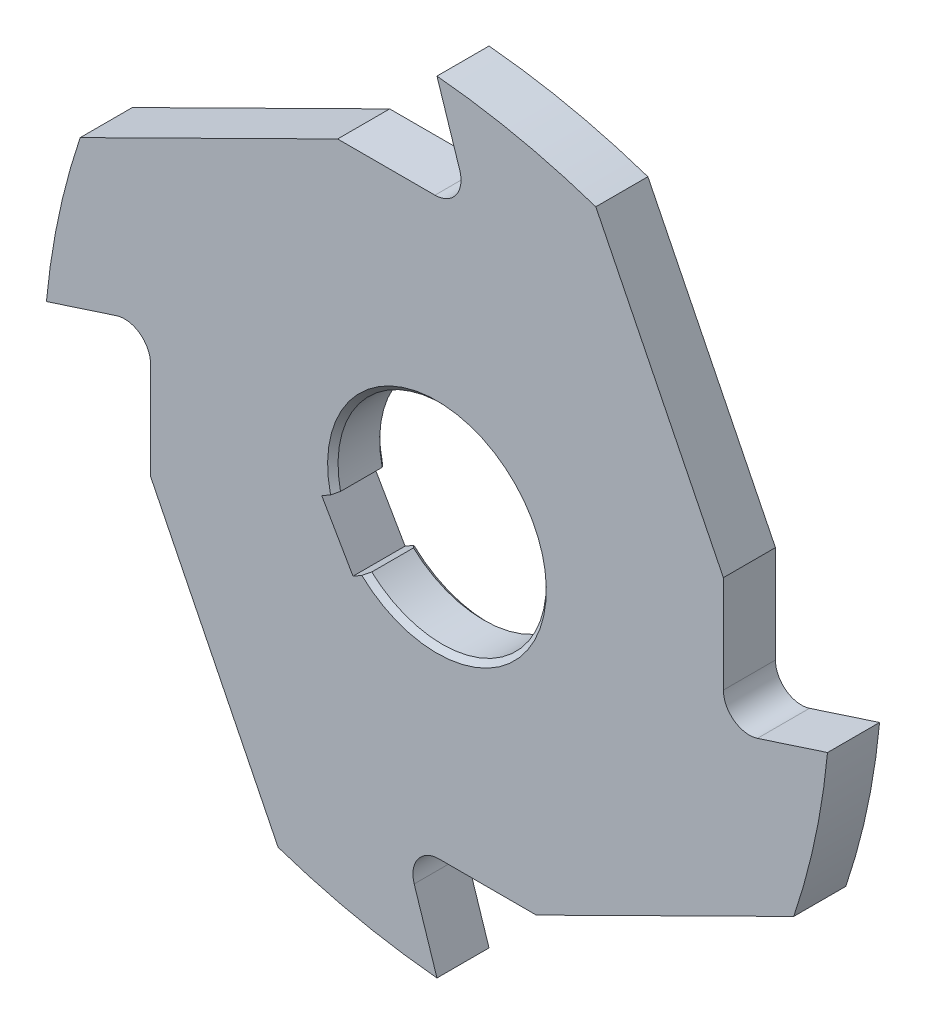
ISO-10303-21;
HEADER;
FILE_DESCRIPTION(('STEP AP214'),'2;1');
FILE_NAME('part.step','',(''),(''),'','','');
FILE_SCHEMA(('AUTOMOTIVE_DESIGN { 1 0 10303 214 1 1 1 1 }'));
ENDSEC;
DATA;
#1=APPLICATION_CONTEXT('core data for automotive mechanical design processes');
#2=APPLICATION_PROTOCOL_DEFINITION('international standard','automotive_design',2000,#1);
#3=PRODUCT_CONTEXT('',#1,'mechanical');
#4=PRODUCT('Part','Part','',(#3));
#5=PRODUCT_RELATED_PRODUCT_CATEGORY('part','',(#4));
#6=PRODUCT_DEFINITION_FORMATION('','',#4);
#7=PRODUCT_DEFINITION_CONTEXT('part definition',#1,'design');
#8=PRODUCT_DEFINITION('design','',#6,#7);
#9=PRODUCT_DEFINITION_SHAPE('','',#8);
#10=(LENGTH_UNIT() NAMED_UNIT(*) SI_UNIT(.MILLI.,.METRE.));
#11=(NAMED_UNIT(*) PLANE_ANGLE_UNIT() SI_UNIT($,.RADIAN.));
#12=(NAMED_UNIT(*) SI_UNIT($,.STERADIAN.) SOLID_ANGLE_UNIT());
#13=UNCERTAINTY_MEASURE_WITH_UNIT(LENGTH_MEASURE(1.E-05),#10,'distance_accuracy_value','');
#14=(GEOMETRIC_REPRESENTATION_CONTEXT(3) GLOBAL_UNCERTAINTY_ASSIGNED_CONTEXT((#13)) GLOBAL_UNIT_ASSIGNED_CONTEXT((#10,
#11,#12)) REPRESENTATION_CONTEXT('',''));
#15=CARTESIAN_POINT('',(0.,0.,0.));
#16=DIRECTION('',(0.,0.,1.));
#17=DIRECTION('',(1.,0.,0.));
#18=AXIS2_PLACEMENT_3D('',#15,#16,#17);
#19=CARTESIAN_POINT('',(0.,0.,-10.));
#20=DIRECTION('',(0.,0.,1.));
#21=DIRECTION('',(1.,0.,0.));
#22=AXIS2_PLACEMENT_3D('',#19,#20,#21);
#23=CYLINDRICAL_SURFACE('',#22,20.);
#24=DIRECTION('',(0.,0.,1.));
#25=VECTOR('',#24,1.);
#26=CARTESIAN_POINT('',(-19.5227116418583,-4.34323959146264,-10.));
#27=LINE('',#26,#25);
#28=CARTESIAN_POINT('',(-19.5227116418583,-4.34323959146264,-8.99999999999998));
#29=VERTEX_POINT('',#28);
#30=CARTESIAN_POINT('',(-19.5227116418583,-4.34323959146264,-1.));
#31=VERTEX_POINT('',#30);
#32=EDGE_CURVE('E351',#29,#31,#27,.T.);
#33=ORIENTED_EDGE('',*,*,#32,.F.);
#34=CARTESIAN_POINT('',(0.,0.,-8.99999999999998));
#35=DIRECTION('',(0.,0.,1.));
#36=DIRECTION('',(1.,0.,0.));
#37=AXIS2_PLACEMENT_3D('',#34,#35,#36);
#38=CIRCLE('',#37,20.);
#39=CARTESIAN_POINT('',(-13.5227116418584,-14.735544436876,-8.99999999999998));
#40=VERTEX_POINT('',#39);
#41=EDGE_CURVE('E529',#29,#40,#38,.F.);
#42=ORIENTED_EDGE('',*,*,#41,.T.);
#43=DIRECTION('',(0.,0.,1.));
#44=VECTOR('',#43,1.);
#45=CARTESIAN_POINT('',(-13.5227116418584,-14.735544436876,-10.));
#46=LINE('',#45,#44);
#47=CARTESIAN_POINT('',(-13.5227116418584,-14.735544436876,-1.));
#48=VERTEX_POINT('',#47);
#49=EDGE_CURVE('E361',#40,#48,#46,.T.);
#50=ORIENTED_EDGE('',*,*,#49,.T.);
#51=CARTESIAN_POINT('',(0.,0.,-1.));
#52=DIRECTION('',(0.,0.,1.));
#53=DIRECTION('',(1.,0.,0.));
#54=AXIS2_PLACEMENT_3D('',#51,#52,#53);
#55=CIRCLE('',#54,20.);
#56=EDGE_CURVE('E531',#48,#31,#55,.T.);
#57=ORIENTED_EDGE('',*,*,#56,.T.);
#58=EDGE_LOOP('',(#33,#42,#50,#57));
#59=FACE_BOUND('',#58,.T.);
#60=ADVANCED_FACE('F35',(#59),#23,.F.);
#61=CARTESIAN_POINT('',(-2.99999999999996,5.19615242270667,-10.));
#62=DIRECTION('',(-0.499999999999992,0.866025403784443,0.));
#63=DIRECTION('',(-0.866025403784443,-0.499999999999992,0.));
#64=AXIS2_PLACEMENT_3D('',#61,#62,#63);
#65=PLANE('',#64);
#66=DIRECTION('',(-0.866025403784443,-0.499999999999992,0.));
#67=VECTOR('',#66,1.);
#68=CARTESIAN_POINT('',(-2.99999999999996,5.19615242270667,-10.));
#69=LINE('',#68,#67);
#70=CARTESIAN_POINT('',(-20.4284250579334,-4.86615347604223,-10.));
#71=VERTEX_POINT('',#70);
#72=CARTESIAN_POINT('',(-22.1207878532117,-5.84323959146262,-10.));
#73=VERTEX_POINT('',#72);
#74=EDGE_CURVE('E220',#71,#73,#69,.T.);
#75=ORIENTED_EDGE('',*,*,#74,.F.);
#76=CARTESIAN_POINT('',(-20.4284250579334,-4.86615347604223,-10.));
#77=CARTESIAN_POINT('',(-20.2776376878443,-4.77909634733089,-9.83313424107122));
#78=CARTESIAN_POINT('',(-20.1267678853946,-4.69199162627397,-9.66636802893565));
#79=CARTESIAN_POINT('',(-19.8248634133722,-4.51768699808229,-9.33303469559914));
#80=CARTESIAN_POINT('',(-19.6738287437969,-4.43048709094601,-9.16646757440137));
#81=CARTESIAN_POINT('',(-19.5227116418583,-4.34323959146264,-8.99999999999998));
#82=B_SPLINE_CURVE_WITH_KNOTS('',3,(#76,#77,#78,#79,#80,#81),.UNSPECIFIED.,.F.,.F.,(4,2,4),(0.,
0.723490907396186,1.44698182630377),.UNSPECIFIED.);
#83=EDGE_CURVE('E407',#71,#29,#82,.T.);
#84=ORIENTED_EDGE('',*,*,#83,.T.);
#85=ORIENTED_EDGE('',*,*,#32,.T.);
#86=CARTESIAN_POINT('',(-19.5227116418583,-4.34323959146264,-1.));
#87=CARTESIAN_POINT('',(-19.6738287437969,-4.43048709094601,-0.833532425598619));
#88=CARTESIAN_POINT('',(-19.8248634133722,-4.51768699808229,-0.666965304400846));
#89=CARTESIAN_POINT('',(-20.1267678853946,-4.69199162627397,-0.333631971064344));
#90=CARTESIAN_POINT('',(-20.2776376878443,-4.7790963473309,-0.166865758928782));
#91=CARTESIAN_POINT('',(-20.4284250579334,-4.86615347604224,0.));
#92=B_SPLINE_CURVE_WITH_KNOTS('',3,(#86,#87,#88,#89,#90,#91),.UNSPECIFIED.,.F.,.F.,(4,2,4),(0.,
0.723490918907581,1.44698182630377),.UNSPECIFIED.);
#93=CARTESIAN_POINT('',(-20.4284250579334,-4.86615347604224,0.));
#94=VERTEX_POINT('',#93);
#95=EDGE_CURVE('E401',#31,#94,#92,.T.);
#96=ORIENTED_EDGE('',*,*,#95,.T.);
#97=DIRECTION('',(-0.866025403784443,-0.499999999999992,0.));
#98=VECTOR('',#97,1.);
#99=CARTESIAN_POINT('',(-2.99999999999996,5.19615242270667,0.));
#100=LINE('',#99,#98);
#101=CARTESIAN_POINT('',(-22.1207878532117,-5.84323959146262,0.));
#102=VERTEX_POINT('',#101);
#103=EDGE_CURVE('E229',#94,#102,#100,.T.);
#104=ORIENTED_EDGE('',*,*,#103,.T.);
#105=DIRECTION('',(0.,0.,1.));
#106=VECTOR('',#105,1.);
#107=CARTESIAN_POINT('',(-22.1207878532117,-5.84323959146262,-10.));
#108=LINE('',#107,#106);
#109=EDGE_CURVE('E355',#73,#102,#108,.T.);
#110=ORIENTED_EDGE('',*,*,#109,.F.);
#111=EDGE_LOOP('',(#75,#84,#85,#96,#104,#110));
#112=FACE_BOUND('',#111,.T.);
#113=ADVANCED_FACE('F412',(#112),#65,.F.);
#114=CARTESIAN_POINT('',(-19.1207878532117,-11.0393920141693,-10.));
#115=DIRECTION('',(0.866025403784443,0.499999999999992,0.));
#116=DIRECTION('',(-0.499999999999992,0.866025403784443,0.));
#117=AXIS2_PLACEMENT_3D('',#114,#115,#116);
#118=PLANE('',#117);
#119=DIRECTION('',(-0.499999999999992,0.866025403784443,0.));
#120=VECTOR('',#119,1.);
#121=CARTESIAN_POINT('',(-19.1207878532117,-11.0393920141693,0.));
#122=LINE('',#121,#120);
#123=CARTESIAN_POINT('',(-16.1207878532118,-16.2355444368759,0.));
#124=VERTEX_POINT('',#123);
#125=EDGE_CURVE('E347',#124,#102,#122,.T.);
#126=ORIENTED_EDGE('',*,*,#125,.F.);
#127=DIRECTION('',(0.,0.,1.));
#128=VECTOR('',#127,1.);
#129=CARTESIAN_POINT('',(-16.1207878532118,-16.2355444368759,-10.));
#130=LINE('',#129,#128);
#131=CARTESIAN_POINT('',(-16.1207878532118,-16.2355444368759,-10.));
#132=VERTEX_POINT('',#131);
#133=EDGE_CURVE('E358',#132,#124,#130,.T.);
#134=ORIENTED_EDGE('',*,*,#133,.F.);
#135=DIRECTION('',(-0.499999999999992,0.866025403784443,0.));
#136=VECTOR('',#135,1.);
#137=CARTESIAN_POINT('',(-19.1207878532117,-11.0393920141693,-10.));
#138=LINE('',#137,#136);
#139=EDGE_CURVE('E284',#132,#73,#138,.T.);
#140=ORIENTED_EDGE('',*,*,#139,.T.);
#141=ORIENTED_EDGE('',*,*,#109,.T.);
#142=EDGE_LOOP('',(#126,#134,#140,#141));
#143=FACE_BOUND('',#142,.T.);
#144=ADVANCED_FACE('F417',(#143),#118,.T.);
#145=CARTESIAN_POINT('',(-60.,-0.3835156776972,-10.));
#146=DIRECTION('',(0.,0.,1.));
#147=DIRECTION('',(1.,0.,0.));
#148=AXIS2_PLACEMENT_3D('',#145,#146,#147);
#149=CYLINDRICAL_SURFACE('',#148,4.99999999999999);
#150=CARTESIAN_POINT('',(-60.,-0.3835156776972,0.));
#151=DIRECTION('',(0.,0.,1.));
#152=DIRECTION('',(1.,0.,0.));
#153=AXIS2_PLACEMENT_3D('',#150,#151,#152);
#154=CIRCLE('',#153,4.99999999999999);
#155=CARTESIAN_POINT('',(-55.,-0.383515677697252,0.));
#156=VERTEX_POINT('',#155);
#157=CARTESIAN_POINT('',(-61.5450849718746,4.3717669037786,0.));
#158=VERTEX_POINT('',#157);
#159=EDGE_CURVE('E288',#156,#158,#154,.T.);
#160=ORIENTED_EDGE('',*,*,#159,.T.);
#161=DIRECTION('',(0.,0.,1.));
#162=VECTOR('',#161,1.);
#163=CARTESIAN_POINT('',(-61.5450849718746,4.3717669037786,-10.));
#164=LINE('',#163,#162);
#165=CARTESIAN_POINT('',(-61.5450849718746,4.3717669037786,-10.));
#166=VERTEX_POINT('',#165);
#167=EDGE_CURVE('E225',#166,#158,#164,.T.);
#168=ORIENTED_EDGE('',*,*,#167,.F.);
#169=CARTESIAN_POINT('',(-60.,-0.3835156776972,-10.));
#170=DIRECTION('',(0.,0.,1.));
#171=DIRECTION('',(1.,0.,0.));
#172=AXIS2_PLACEMENT_3D('',#169,#170,#171);
#173=CIRCLE('',#172,4.99999999999999);
#174=CARTESIAN_POINT('',(-55.,-0.383515677697252,-10.));
#175=VERTEX_POINT('',#174);
#176=EDGE_CURVE('E223',#175,#166,#173,.T.);
#177=ORIENTED_EDGE('',*,*,#176,.F.);
#178=DIRECTION('',(0.,0.,1.));
#179=VECTOR('',#178,1.);
#180=CARTESIAN_POINT('',(-55.,-0.383515677697252,-10.));
#181=LINE('',#180,#179);
#182=EDGE_CURVE('E209',#175,#156,#181,.T.);
#183=ORIENTED_EDGE('',*,*,#182,.T.);
#184=EDGE_LOOP('',(#160,#168,#177,#183));
#185=FACE_BOUND('',#184,.T.);
#186=ADVANCED_FACE('F224',(#185),#149,.F.);
#187=CARTESIAN_POINT('',(-7.16186271093895,22.0419469609674,-10.));
#188=DIRECTION('',(0.309016994374931,-0.951056516295159,0.));
#189=DIRECTION('',(0.951056516295159,0.309016994374931,0.));
#190=AXIS2_PLACEMENT_3D('',#187,#188,#189);
#191=PLANE('',#190);
#192=DIRECTION('',(0.951056516295159,0.309016994374931,0.));
#193=VECTOR('',#192,1.);
#194=CARTESIAN_POINT('',(-7.16186271093895,22.0419469609674,0.));
#195=LINE('',#194,#193);
#196=CARTESIAN_POINT('',(-75.,7.8756445809347E-13,0.));
#197=VERTEX_POINT('',#196);
#198=EDGE_CURVE('E342',#197,#158,#195,.T.);
#199=ORIENTED_EDGE('',*,*,#198,.F.);
#200=DIRECTION('',(0.,0.,1.));
#201=VECTOR('',#200,1.);
#202=CARTESIAN_POINT('',(-75.,7.8756445809347E-13,-10.));
#203=LINE('',#202,#201);
#204=CARTESIAN_POINT('',(-75.,7.8756445809347E-13,-10.));
#205=VERTEX_POINT('',#204);
#206=EDGE_CURVE('E364',#205,#197,#203,.T.);
#207=ORIENTED_EDGE('',*,*,#206,.F.);
#208=DIRECTION('',(0.951056516295159,0.309016994374931,0.));
#209=VECTOR('',#208,1.);
#210=CARTESIAN_POINT('',(-7.16186271093895,22.0419469609674,-10.));
#211=LINE('',#210,#209);
#212=EDGE_CURVE('E280',#205,#166,#211,.T.);
#213=ORIENTED_EDGE('',*,*,#212,.T.);
#214=ORIENTED_EDGE('',*,*,#167,.T.);
#215=EDGE_LOOP('',(#199,#207,#213,#214));
#216=FACE_BOUND('',#215,.T.);
#217=ADVANCED_FACE('F447',(#216),#191,.T.);
#218=CARTESIAN_POINT('',(59.4081249488118,-12.6275867743834,-10.));
#219=DIRECTION('',(0.,0.,1.));
#220=DIRECTION('',(1.,0.,0.));
#221=AXIS2_PLACEMENT_3D('',#218,#219,#220);
#222=CYLINDRICAL_SURFACE('',#221,135.);
#223=CARTESIAN_POINT('',(59.4081249488118,-12.6275867743834,0.));
#224=DIRECTION('',(0.,0.,1.));
#225=DIRECTION('',(1.,0.,0.));
#226=AXIS2_PLACEMENT_3D('',#223,#224,#225);
#227=CIRCLE('',#226,135.);
#228=CARTESIAN_POINT('',(-68.5159093231945,30.5052482306864,0.));
#229=VERTEX_POINT('',#228);
#230=EDGE_CURVE('E339',#197,#229,#227,.F.);
#231=ORIENTED_EDGE('',*,*,#230,.T.);
#232=DIRECTION('',(0.,0.,1.));
#233=VECTOR('',#232,1.);
#234=CARTESIAN_POINT('',(-68.5159093231945,30.5052482306864,-10.));
#235=LINE('',#234,#233);
#236=CARTESIAN_POINT('',(-68.5159093231945,30.5052482306864,-10.));
#237=VERTEX_POINT('',#236);
#238=EDGE_CURVE('E366',#237,#229,#235,.T.);
#239=ORIENTED_EDGE('',*,*,#238,.F.);
#240=CARTESIAN_POINT('',(59.4081249488118,-12.6275867743834,-10.));
#241=DIRECTION('',(0.,0.,1.));
#242=DIRECTION('',(1.,0.,0.));
#243=AXIS2_PLACEMENT_3D('',#240,#241,#242);
#244=CIRCLE('',#243,135.);
#245=EDGE_CURVE('E278',#205,#237,#244,.F.);
#246=ORIENTED_EDGE('',*,*,#245,.F.);
#247=ORIENTED_EDGE('',*,*,#206,.T.);
#248=EDGE_LOOP('',(#231,#239,#246,#247));
#249=FACE_BOUND('',#248,.T.);
#250=ADVANCED_FACE('F513',(#249),#222,.T.);
#251=CARTESIAN_POINT('',(-25.6402170443291,51.7489882953533,-10.));
#252=DIRECTION('',(-0.443965408465407,0.896043925310665,0.));
#253=DIRECTION('',(-0.896043925310665,-0.443965408465407,0.));
#254=AXIS2_PLACEMENT_3D('',#251,#252,#253);
#255=PLANE('',#254);
#256=DIRECTION('',(-0.896043925310665,-0.443965408465407,0.));
#257=VECTOR('',#256,1.);
#258=CARTESIAN_POINT('',(-25.6402170443291,51.7489882953533,0.));
#259=LINE('',#258,#257);
#260=CARTESIAN_POINT('',(-19.0787840283387,55.,0.));
#261=VERTEX_POINT('',#260);
#262=EDGE_CURVE('E336',#261,#229,#259,.T.);
#263=ORIENTED_EDGE('',*,*,#262,.F.);
#264=DIRECTION('',(0.,0.,1.));
#265=VECTOR('',#264,1.);
#266=CARTESIAN_POINT('',(-19.0787840283387,55.,-10.));
#267=LINE('',#266,#265);
#268=CARTESIAN_POINT('',(-19.0787840283387,55.,-10.));
#269=VERTEX_POINT('',#268);
#270=EDGE_CURVE('E368',#269,#261,#267,.T.);
#271=ORIENTED_EDGE('',*,*,#270,.F.);
#272=DIRECTION('',(-0.896043925310665,-0.443965408465407,0.));
#273=VECTOR('',#272,1.);
#274=CARTESIAN_POINT('',(-25.6402170443291,51.7489882953533,-10.));
#275=LINE('',#274,#273);
#276=EDGE_CURVE('E275',#269,#237,#275,.T.);
#277=ORIENTED_EDGE('',*,*,#276,.T.);
#278=ORIENTED_EDGE('',*,*,#238,.T.);
#279=EDGE_LOOP('',(#263,#271,#277,#278));
#280=FACE_BOUND('',#279,.T.);
#281=ADVANCED_FACE('F509',(#280),#255,.T.);
#282=CARTESIAN_POINT('',(0.,55.,-10.));
#283=DIRECTION('',(0.,1.,0.));
#284=DIRECTION('',(-1.,0.,0.));
#285=AXIS2_PLACEMENT_3D('',#282,#283,#284);
#286=PLANE('',#285);
#287=DIRECTION('',(-1.,0.,0.));
#288=VECTOR('',#287,1.);
#289=CARTESIAN_POINT('',(0.,55.,0.));
#290=LINE('',#289,#288);
#291=CARTESIAN_POINT('',(-0.383515677697828,55.,0.));
#292=VERTEX_POINT('',#291);
#293=EDGE_CURVE('E333',#292,#261,#290,.T.);
#294=ORIENTED_EDGE('',*,*,#293,.F.);
#295=DIRECTION('',(0.,0.,1.));
#296=VECTOR('',#295,1.);
#297=CARTESIAN_POINT('',(-0.383515677697828,55.,-10.));
#298=LINE('',#297,#296);
#299=CARTESIAN_POINT('',(-0.383515677697828,55.,-10.));
#300=VERTEX_POINT('',#299);
#301=EDGE_CURVE('E370',#300,#292,#298,.T.);
#302=ORIENTED_EDGE('',*,*,#301,.F.);
#303=DIRECTION('',(-1.,0.,0.));
#304=VECTOR('',#303,1.);
#305=CARTESIAN_POINT('',(0.,55.,-10.));
#306=LINE('',#305,#304);
#307=EDGE_CURVE('E272',#300,#269,#306,.T.);
#308=ORIENTED_EDGE('',*,*,#307,.T.);
#309=ORIENTED_EDGE('',*,*,#270,.T.);
#310=EDGE_LOOP('',(#294,#302,#308,#309));
#311=FACE_BOUND('',#310,.T.);
#312=ADVANCED_FACE('F505',(#311),#286,.T.);
#313=CARTESIAN_POINT('',(-0.383515677697828,60.,-10.));
#314=DIRECTION('',(0.,0.,1.));
#315=DIRECTION('',(1.,0.,0.));
#316=AXIS2_PLACEMENT_3D('',#313,#314,#315);
#317=CYLINDRICAL_SURFACE('',#316,4.99999999999999);
#318=CARTESIAN_POINT('',(-0.383515677697828,60.,0.));
#319=DIRECTION('',(0.,0.,1.));
#320=DIRECTION('',(1.,0.,0.));
#321=AXIS2_PLACEMENT_3D('',#318,#319,#320);
#322=CIRCLE('',#321,4.99999999999999);
#323=CARTESIAN_POINT('',(4.37176690377795,61.5450849718747,0.));
#324=VERTEX_POINT('',#323);
#325=EDGE_CURVE('E330',#292,#324,#322,.T.);
#326=ORIENTED_EDGE('',*,*,#325,.T.);
#327=DIRECTION('',(0.,0.,1.));
#328=VECTOR('',#327,1.);
#329=CARTESIAN_POINT('',(4.37176690377795,61.5450849718747,-10.));
#330=LINE('',#329,#328);
#331=CARTESIAN_POINT('',(4.37176690377795,61.5450849718747,-10.));
#332=VERTEX_POINT('',#331);
#333=EDGE_CURVE('E372',#332,#324,#330,.T.);
#334=ORIENTED_EDGE('',*,*,#333,.F.);
#335=CARTESIAN_POINT('',(-0.383515677697828,60.,-10.));
#336=DIRECTION('',(0.,0.,1.));
#337=DIRECTION('',(1.,0.,0.));
#338=AXIS2_PLACEMENT_3D('',#335,#336,#337);
#339=CIRCLE('',#338,4.99999999999999);
#340=EDGE_CURVE('E270',#300,#332,#339,.T.);
#341=ORIENTED_EDGE('',*,*,#340,.F.);
#342=ORIENTED_EDGE('',*,*,#301,.T.);
#343=EDGE_LOOP('',(#326,#334,#341,#342));
#344=FACE_BOUND('',#343,.T.);
#345=ADVANCED_FACE('F501',(#344),#317,.F.);
#346=CARTESIAN_POINT('',(22.0419469609674,7.16186271093919,-10.));
#347=DIRECTION('',(-0.951056516295156,-0.309016994374941,0.));
#348=DIRECTION('',(0.309016994374941,-0.951056516295156,0.));
#349=AXIS2_PLACEMENT_3D('',#346,#347,#348);
#350=PLANE('',#349);
#351=DIRECTION('',(0.309016994374941,-0.951056516295156,0.));
#352=VECTOR('',#351,1.);
#353=CARTESIAN_POINT('',(22.0419469609674,7.16186271093919,0.));
#354=LINE('',#353,#352);
#355=CARTESIAN_POINT('',(0.,75.,0.));
#356=VERTEX_POINT('',#355);
#357=EDGE_CURVE('E327',#356,#324,#354,.T.);
#358=ORIENTED_EDGE('',*,*,#357,.F.);
#359=DIRECTION('',(0.,0.,1.));
#360=VECTOR('',#359,1.);
#361=CARTESIAN_POINT('',(0.,75.,-10.));
#362=LINE('',#361,#360);
#363=CARTESIAN_POINT('',(0.,75.,-10.));
#364=VERTEX_POINT('',#363);
#365=EDGE_CURVE('E374',#364,#356,#362,.T.);
#366=ORIENTED_EDGE('',*,*,#365,.F.);
#367=DIRECTION('',(0.309016994374941,-0.951056516295156,0.));
#368=VECTOR('',#367,1.);
#369=CARTESIAN_POINT('',(22.0419469609674,7.16186271093919,-10.));
#370=LINE('',#369,#368);
#371=EDGE_CURVE('E267',#364,#332,#370,.T.);
#372=ORIENTED_EDGE('',*,*,#371,.T.);
#373=ORIENTED_EDGE('',*,*,#333,.T.);
#374=EDGE_LOOP('',(#358,#366,#372,#373));
#375=FACE_BOUND('',#374,.T.);
#376=ADVANCED_FACE('F497',(#375),#350,.T.);
#377=CARTESIAN_POINT('',(-12.6275867743828,-59.4081249488119,-10.));
#378=DIRECTION('',(0.,0.,1.));
#379=DIRECTION('',(1.,0.,0.));
#380=AXIS2_PLACEMENT_3D('',#377,#378,#379);
#381=CYLINDRICAL_SURFACE('',#380,135.);
#382=CARTESIAN_POINT('',(-12.6275867743828,-59.4081249488119,0.));
#383=DIRECTION('',(0.,0.,1.));
#384=DIRECTION('',(1.,0.,0.));
#385=AXIS2_PLACEMENT_3D('',#382,#383,#384);
#386=CIRCLE('',#385,135.);
#387=CARTESIAN_POINT('',(30.5052482306857,68.5159093231948,0.));
#388=VERTEX_POINT('',#387);
#389=EDGE_CURVE('E324',#356,#388,#386,.F.);
#390=ORIENTED_EDGE('',*,*,#389,.T.);
#391=DIRECTION('',(0.,0.,1.));
#392=VECTOR('',#391,1.);
#393=CARTESIAN_POINT('',(30.5052482306857,68.5159093231948,-10.));
#394=LINE('',#393,#392);
#395=CARTESIAN_POINT('',(30.5052482306857,68.5159093231948,-10.));
#396=VERTEX_POINT('',#395);
#397=EDGE_CURVE('E376',#396,#388,#394,.T.);
#398=ORIENTED_EDGE('',*,*,#397,.F.);
#399=CARTESIAN_POINT('',(-12.6275867743828,-59.4081249488119,-10.));
#400=DIRECTION('',(0.,0.,1.));
#401=DIRECTION('',(1.,0.,0.));
#402=AXIS2_PLACEMENT_3D('',#399,#400,#401);
#403=CIRCLE('',#402,135.);
#404=EDGE_CURVE('E265',#364,#396,#403,.F.);
#405=ORIENTED_EDGE('',*,*,#404,.F.);
#406=ORIENTED_EDGE('',*,*,#365,.T.);
#407=EDGE_LOOP('',(#390,#398,#405,#406));
#408=FACE_BOUND('',#407,.T.);
#409=ADVANCED_FACE('F493',(#408),#381,.T.);
#410=CARTESIAN_POINT('',(51.748988295353,25.6402170443297,-10.));
#411=DIRECTION('',(0.89604392531066,0.443965408465416,0.));
#412=DIRECTION('',(-0.443965408465416,0.89604392531066,0.));
#413=AXIS2_PLACEMENT_3D('',#410,#411,#412);
#414=PLANE('',#413);
#415=DIRECTION('',(-0.443965408465416,0.89604392531066,0.));
#416=VECTOR('',#415,1.);
#417=CARTESIAN_POINT('',(51.748988295353,25.6402170443297,0.));
#418=LINE('',#417,#416);
#419=CARTESIAN_POINT('',(55.,19.0787840283389,0.));
#420=VERTEX_POINT('',#419);
#421=EDGE_CURVE('E321',#420,#388,#418,.T.);
#422=ORIENTED_EDGE('',*,*,#421,.F.);
#423=DIRECTION('',(0.,0.,1.));
#424=VECTOR('',#423,1.);
#425=CARTESIAN_POINT('',(55.,19.0787840283389,-10.));
#426=LINE('',#425,#424);
#427=CARTESIAN_POINT('',(55.,19.0787840283389,-10.));
#428=VERTEX_POINT('',#427);
#429=EDGE_CURVE('E378',#428,#420,#426,.T.);
#430=ORIENTED_EDGE('',*,*,#429,.F.);
#431=DIRECTION('',(-0.443965408465416,0.89604392531066,0.));
#432=VECTOR('',#431,1.);
#433=CARTESIAN_POINT('',(51.748988295353,25.6402170443297,-10.));
#434=LINE('',#433,#432);
#435=EDGE_CURVE('E262',#428,#396,#434,.T.);
#436=ORIENTED_EDGE('',*,*,#435,.T.);
#437=ORIENTED_EDGE('',*,*,#397,.T.);
#438=EDGE_LOOP('',(#422,#430,#436,#437));
#439=FACE_BOUND('',#438,.T.);
#440=ADVANCED_FACE('F489',(#439),#414,.T.);
#441=CARTESIAN_POINT('',(55.,0.,-10.));
#442=DIRECTION('',(1.,0.,0.));
#443=DIRECTION('',(0.,1.,0.));
#444=AXIS2_PLACEMENT_3D('',#441,#442,#443);
#445=PLANE('',#444);
#446=DIRECTION('',(0.,1.,0.));
#447=VECTOR('',#446,1.);
#448=CARTESIAN_POINT('',(55.,0.,0.));
#449=LINE('',#448,#447);
#450=CARTESIAN_POINT('',(55.,0.383515677697636,0.));
#451=VERTEX_POINT('',#450);
#452=EDGE_CURVE('E318',#451,#420,#449,.T.);
#453=ORIENTED_EDGE('',*,*,#452,.F.);
#454=DIRECTION('',(0.,0.,1.));
#455=VECTOR('',#454,1.);
#456=CARTESIAN_POINT('',(55.,0.383515677697636,-10.));
#457=LINE('',#456,#455);
#458=CARTESIAN_POINT('',(55.,0.383515677697636,-10.));
#459=VERTEX_POINT('',#458);
#460=EDGE_CURVE('E380',#459,#451,#457,.T.);
#461=ORIENTED_EDGE('',*,*,#460,.F.);
#462=DIRECTION('',(0.,1.,0.));
#463=VECTOR('',#462,1.);
#464=CARTESIAN_POINT('',(55.,0.,-10.));
#465=LINE('',#464,#463);
#466=EDGE_CURVE('E259',#459,#428,#465,.T.);
#467=ORIENTED_EDGE('',*,*,#466,.T.);
#468=ORIENTED_EDGE('',*,*,#429,.T.);
#469=EDGE_LOOP('',(#453,#461,#467,#468));
#470=FACE_BOUND('',#469,.T.);
#471=ADVANCED_FACE('F485',(#470),#445,.T.);
#472=CARTESIAN_POINT('',(60.,0.383515677697619,-10.));
#473=DIRECTION('',(0.,0.,1.));
#474=DIRECTION('',(1.,0.,0.));
#475=AXIS2_PLACEMENT_3D('',#472,#473,#474);
#476=CYLINDRICAL_SURFACE('',#475,5.);
#477=CARTESIAN_POINT('',(60.,0.383515677697619,0.));
#478=DIRECTION('',(0.,0.,1.));
#479=DIRECTION('',(1.,0.,0.));
#480=AXIS2_PLACEMENT_3D('',#477,#478,#479);
#481=CIRCLE('',#480,5.);
#482=CARTESIAN_POINT('',(61.5450849718747,-4.37176690377817,0.));
#483=VERTEX_POINT('',#482);
#484=EDGE_CURVE('E315',#451,#483,#481,.T.);
#485=ORIENTED_EDGE('',*,*,#484,.T.);
#486=DIRECTION('',(0.,0.,1.));
#487=VECTOR('',#486,1.);
#488=CARTESIAN_POINT('',(61.5450849718747,-4.37176690377817,-10.));
#489=LINE('',#488,#487);
#490=CARTESIAN_POINT('',(61.5450849718747,-4.37176690377817,-10.));
#491=VERTEX_POINT('',#490);
#492=EDGE_CURVE('E382',#491,#483,#489,.T.);
#493=ORIENTED_EDGE('',*,*,#492,.F.);
#494=CARTESIAN_POINT('',(60.,0.383515677697619,-10.));
#495=DIRECTION('',(0.,0.,1.));
#496=DIRECTION('',(1.,0.,0.));
#497=AXIS2_PLACEMENT_3D('',#494,#495,#496);
#498=CIRCLE('',#497,5.);
#499=EDGE_CURVE('E257',#459,#491,#498,.T.);
#500=ORIENTED_EDGE('',*,*,#499,.F.);
#501=ORIENTED_EDGE('',*,*,#460,.T.);
#502=EDGE_LOOP('',(#485,#493,#500,#501));
#503=FACE_BOUND('',#502,.T.);
#504=ADVANCED_FACE('F481',(#503),#476,.F.);
#505=CARTESIAN_POINT('',(7.16186271093912,-22.0419469609674,-10.));
#506=DIRECTION('',(-0.309016994374938,0.951056516295157,0.));
#507=DIRECTION('',(-0.951056516295157,-0.309016994374938,0.));
#508=AXIS2_PLACEMENT_3D('',#505,#506,#507);
#509=PLANE('',#508);
#510=DIRECTION('',(-0.951056516295157,-0.309016994374938,0.));
#511=VECTOR('',#510,1.);
#512=CARTESIAN_POINT('',(7.16186271093912,-22.0419469609674,0.));
#513=LINE('',#512,#511);
#514=CARTESIAN_POINT('',(75.,-2.63677968348475E-13,0.));
#515=VERTEX_POINT('',#514);
#516=EDGE_CURVE('E312',#515,#483,#513,.T.);
#517=ORIENTED_EDGE('',*,*,#516,.F.);
#518=DIRECTION('',(0.,0.,1.));
#519=VECTOR('',#518,1.);
#520=CARTESIAN_POINT('',(75.,-2.63677968348475E-13,-10.));
#521=LINE('',#520,#519);
#522=CARTESIAN_POINT('',(75.,-2.63677968348475E-13,-10.));
#523=VERTEX_POINT('',#522);
#524=EDGE_CURVE('E384',#523,#515,#521,.T.);
#525=ORIENTED_EDGE('',*,*,#524,.F.);
#526=DIRECTION('',(-0.951056516295157,-0.309016994374938,0.));
#527=VECTOR('',#526,1.);
#528=CARTESIAN_POINT('',(7.16186271093912,-22.0419469609674,-10.));
#529=LINE('',#528,#527);
#530=EDGE_CURVE('E254',#523,#491,#529,.T.);
#531=ORIENTED_EDGE('',*,*,#530,.T.);
#532=ORIENTED_EDGE('',*,*,#492,.T.);
#533=EDGE_LOOP('',(#517,#525,#531,#532));
#534=FACE_BOUND('',#533,.T.);
#535=ADVANCED_FACE('F477',(#534),#509,.T.);
#536=CARTESIAN_POINT('',(-59.4081249488119,12.627586774383,-10.));
#537=DIRECTION('',(0.,0.,1.));
#538=DIRECTION('',(1.,0.,0.));
#539=AXIS2_PLACEMENT_3D('',#536,#537,#538);
#540=CYLINDRICAL_SURFACE('',#539,135.);
#541=CARTESIAN_POINT('',(-59.4081249488119,12.627586774383,0.));
#542=DIRECTION('',(0.,0.,1.));
#543=DIRECTION('',(1.,0.,0.));
#544=AXIS2_PLACEMENT_3D('',#541,#542,#543);
#545=CIRCLE('',#544,135.);
#546=CARTESIAN_POINT('',(68.5159093231947,-30.5052482306859,0.));
#547=VERTEX_POINT('',#546);
#548=EDGE_CURVE('E309',#515,#547,#545,.F.);
#549=ORIENTED_EDGE('',*,*,#548,.T.);
#550=DIRECTION('',(0.,0.,1.));
#551=VECTOR('',#550,1.);
#552=CARTESIAN_POINT('',(68.5159093231947,-30.5052482306859,-10.));
#553=LINE('',#552,#551);
#554=CARTESIAN_POINT('',(68.5159093231947,-30.5052482306859,-10.));
#555=VERTEX_POINT('',#554);
#556=EDGE_CURVE('E386',#555,#547,#553,.T.);
#557=ORIENTED_EDGE('',*,*,#556,.F.);
#558=CARTESIAN_POINT('',(-59.4081249488119,12.627586774383,-10.));
#559=DIRECTION('',(0.,0.,1.));
#560=DIRECTION('',(1.,0.,0.));
#561=AXIS2_PLACEMENT_3D('',#558,#559,#560);
#562=CIRCLE('',#561,135.);
#563=EDGE_CURVE('E252',#523,#555,#562,.F.);
#564=ORIENTED_EDGE('',*,*,#563,.F.);
#565=ORIENTED_EDGE('',*,*,#524,.T.);
#566=EDGE_LOOP('',(#549,#557,#564,#565));
#567=FACE_BOUND('',#566,.T.);
#568=ADVANCED_FACE('F473',(#567),#540,.T.);
#569=CARTESIAN_POINT('',(25.6402170443295,-51.7489882953531,-10.));
#570=DIRECTION('',(0.443965408465413,-0.896043925310662,0.));
#571=DIRECTION('',(0.896043925310662,0.443965408465413,0.));
#572=AXIS2_PLACEMENT_3D('',#569,#570,#571);
#573=PLANE('',#572);
#574=DIRECTION('',(0.896043925310662,0.443965408465413,0.));
#575=VECTOR('',#574,1.);
#576=CARTESIAN_POINT('',(25.6402170443295,-51.7489882953531,0.));
#577=LINE('',#576,#575);
#578=CARTESIAN_POINT('',(19.0787840283387,-55.0000000000001,0.));
#579=VERTEX_POINT('',#578);
#580=EDGE_CURVE('E306',#579,#547,#577,.T.);
#581=ORIENTED_EDGE('',*,*,#580,.F.);
#582=DIRECTION('',(0.,0.,1.));
#583=VECTOR('',#582,1.);
#584=CARTESIAN_POINT('',(19.0787840283387,-55.0000000000001,-10.));
#585=LINE('',#584,#583);
#586=CARTESIAN_POINT('',(19.0787840283387,-55.0000000000001,-10.));
#587=VERTEX_POINT('',#586);
#588=EDGE_CURVE('E388',#587,#579,#585,.T.);
#589=ORIENTED_EDGE('',*,*,#588,.F.);
#590=DIRECTION('',(0.896043925310662,0.443965408465413,0.));
#591=VECTOR('',#590,1.);
#592=CARTESIAN_POINT('',(25.6402170443295,-51.7489882953531,-10.));
#593=LINE('',#592,#591);
#594=EDGE_CURVE('E249',#587,#555,#593,.T.);
#595=ORIENTED_EDGE('',*,*,#594,.T.);
#596=ORIENTED_EDGE('',*,*,#556,.T.);
#597=EDGE_LOOP('',(#581,#589,#595,#596));
#598=FACE_BOUND('',#597,.T.);
#599=ADVANCED_FACE('F469',(#598),#573,.T.);
#600=CARTESIAN_POINT('',(-1.80029947261431E-13,-55.,-10.));
#601=DIRECTION('',(0.,-1.,0.));
#602=DIRECTION('',(1.,0.,0.));
#603=AXIS2_PLACEMENT_3D('',#600,#601,#602);
#604=PLANE('',#603);
#605=DIRECTION('',(1.,0.,0.));
#606=VECTOR('',#605,1.);
#607=CARTESIAN_POINT('',(-1.80029947261431E-13,-55.,0.));
#608=LINE('',#607,#606);
#609=CARTESIAN_POINT('',(0.383515677697444,-55.,0.));
#610=VERTEX_POINT('',#609);
#611=EDGE_CURVE('E303',#610,#579,#608,.T.);
#612=ORIENTED_EDGE('',*,*,#611,.F.);
#613=DIRECTION('',(0.,0.,1.));
#614=VECTOR('',#613,1.);
#615=CARTESIAN_POINT('',(0.383515677697444,-55.,-10.));
#616=LINE('',#615,#614);
#617=CARTESIAN_POINT('',(0.383515677697444,-55.,-10.));
#618=VERTEX_POINT('',#617);
#619=EDGE_CURVE('E390',#618,#610,#616,.T.);
#620=ORIENTED_EDGE('',*,*,#619,.F.);
#621=DIRECTION('',(1.,0.,0.));
#622=VECTOR('',#621,1.);
#623=CARTESIAN_POINT('',(-1.80029947261431E-13,-55.,-10.));
#624=LINE('',#623,#622);
#625=EDGE_CURVE('E246',#618,#587,#624,.T.);
#626=ORIENTED_EDGE('',*,*,#625,.T.);
#627=ORIENTED_EDGE('',*,*,#588,.T.);
#628=EDGE_LOOP('',(#612,#620,#626,#627));
#629=FACE_BOUND('',#628,.T.);
#630=ADVANCED_FACE('F465',(#629),#604,.T.);
#631=CARTESIAN_POINT('',(0.38351567769741,-60.,-10.));
#632=DIRECTION('',(0.,0.,1.));
#633=DIRECTION('',(1.,0.,0.));
#634=AXIS2_PLACEMENT_3D('',#631,#632,#633);
#635=CYLINDRICAL_SURFACE('',#634,5.);
#636=CARTESIAN_POINT('',(0.38351567769741,-60.,0.));
#637=DIRECTION('',(0.,0.,1.));
#638=DIRECTION('',(1.,0.,0.));
#639=AXIS2_PLACEMENT_3D('',#636,#637,#638);
#640=CIRCLE('',#639,5.);
#641=CARTESIAN_POINT('',(-4.37176690377838,-61.5450849718747,0.));
#642=VERTEX_POINT('',#641);
#643=EDGE_CURVE('E300',#610,#642,#640,.T.);
#644=ORIENTED_EDGE('',*,*,#643,.T.);
#645=DIRECTION('',(0.,0.,1.));
#646=VECTOR('',#645,1.);
#647=CARTESIAN_POINT('',(-4.37176690377838,-61.5450849718747,-10.));
#648=LINE('',#647,#646);
#649=CARTESIAN_POINT('',(-4.37176690377838,-61.5450849718747,-10.));
#650=VERTEX_POINT('',#649);
#651=EDGE_CURVE('E392',#650,#642,#648,.T.);
#652=ORIENTED_EDGE('',*,*,#651,.F.);
#653=CARTESIAN_POINT('',(0.38351567769741,-60.,-10.));
#654=DIRECTION('',(0.,0.,1.));
#655=DIRECTION('',(1.,0.,0.));
#656=AXIS2_PLACEMENT_3D('',#653,#654,#655);
#657=CIRCLE('',#656,5.);
#658=EDGE_CURVE('E244',#618,#650,#657,.T.);
#659=ORIENTED_EDGE('',*,*,#658,.F.);
#660=ORIENTED_EDGE('',*,*,#619,.T.);
#661=EDGE_LOOP('',(#644,#652,#659,#660));
#662=FACE_BOUND('',#661,.T.);
#663=ADVANCED_FACE('F461',(#662),#635,.F.);
#664=CARTESIAN_POINT('',(-22.0419469609674,-7.16186271093904,-10.));
#665=DIRECTION('',(0.951056516295158,0.309016994374935,0.));
#666=DIRECTION('',(-0.309016994374935,0.951056516295158,0.));
#667=AXIS2_PLACEMENT_3D('',#664,#665,#666);
#668=PLANE('',#667);
#669=DIRECTION('',(-0.309016994374935,0.951056516295158,0.));
#670=VECTOR('',#669,1.);
#671=CARTESIAN_POINT('',(-22.0419469609674,-7.16186271093904,0.));
#672=LINE('',#671,#670);
#673=CARTESIAN_POINT('',(-5.20417042793042E-13,-75.,0.));
#674=VERTEX_POINT('',#673);
#675=EDGE_CURVE('E297',#674,#642,#672,.T.);
#676=ORIENTED_EDGE('',*,*,#675,.F.);
#677=DIRECTION('',(0.,0.,1.));
#678=VECTOR('',#677,1.);
#679=CARTESIAN_POINT('',(-5.20417042793042E-13,-75.,-10.));
#680=LINE('',#679,#678);
#681=CARTESIAN_POINT('',(-5.20417042793042E-13,-75.,-10.));
#682=VERTEX_POINT('',#681);
#683=EDGE_CURVE('E394',#682,#674,#680,.T.);
#684=ORIENTED_EDGE('',*,*,#683,.F.);
#685=DIRECTION('',(-0.309016994374935,0.951056516295158,0.));
#686=VECTOR('',#685,1.);
#687=CARTESIAN_POINT('',(-22.0419469609674,-7.16186271093904,-10.));
#688=LINE('',#687,#686);
#689=EDGE_CURVE('E241',#682,#650,#688,.T.);
#690=ORIENTED_EDGE('',*,*,#689,.T.);
#691=ORIENTED_EDGE('',*,*,#651,.T.);
#692=EDGE_LOOP('',(#676,#684,#690,#691));
#693=FACE_BOUND('',#692,.T.);
#694=ADVANCED_FACE('F457',(#693),#668,.T.);
#695=CARTESIAN_POINT('',(12.6275867743832,59.4081249488118,-10.));
#696=DIRECTION('',(0.,0.,1.));
#697=DIRECTION('',(1.,0.,0.));
#698=AXIS2_PLACEMENT_3D('',#695,#696,#697);
#699=CYLINDRICAL_SURFACE('',#698,135.);
#700=CARTESIAN_POINT('',(12.6275867743832,59.4081249488118,0.));
#701=DIRECTION('',(0.,0.,1.));
#702=DIRECTION('',(1.,0.,0.));
#703=AXIS2_PLACEMENT_3D('',#700,#701,#702);
#704=CIRCLE('',#703,135.);
#705=CARTESIAN_POINT('',(-30.5052482306862,-68.5159093231946,0.));
#706=VERTEX_POINT('',#705);
#707=EDGE_CURVE('E294',#674,#706,#704,.F.);
#708=ORIENTED_EDGE('',*,*,#707,.T.);
#709=DIRECTION('',(0.,0.,1.));
#710=VECTOR('',#709,1.);
#711=CARTESIAN_POINT('',(-30.5052482306862,-68.5159093231946,-10.));
#712=LINE('',#711,#710);
#713=CARTESIAN_POINT('',(-30.5052482306862,-68.5159093231946,-10.));
#714=VERTEX_POINT('',#713);
#715=EDGE_CURVE('E396',#714,#706,#712,.T.);
#716=ORIENTED_EDGE('',*,*,#715,.F.);
#717=CARTESIAN_POINT('',(12.6275867743832,59.4081249488118,-10.));
#718=DIRECTION('',(0.,0.,1.));
#719=DIRECTION('',(1.,0.,0.));
#720=AXIS2_PLACEMENT_3D('',#717,#718,#719);
#721=CIRCLE('',#720,135.);
#722=EDGE_CURVE('E237',#682,#714,#721,.F.);
#723=ORIENTED_EDGE('',*,*,#722,.F.);
#724=ORIENTED_EDGE('',*,*,#683,.T.);
#725=EDGE_LOOP('',(#708,#716,#723,#724));
#726=FACE_BOUND('',#725,.T.);
#727=ADVANCED_FACE('F453',(#726),#699,.T.);
#728=CARTESIAN_POINT('',(-51.7489882953532,-25.6402170443293,-10.));
#729=DIRECTION('',(-0.896043925310663,-0.44396540846541,0.));
#730=DIRECTION('',(0.44396540846541,-0.896043925310663,0.));
#731=AXIS2_PLACEMENT_3D('',#728,#729,#730);
#732=PLANE('',#731);
#733=DIRECTION('',(0.44396540846541,-0.896043925310663,0.));
#734=VECTOR('',#733,1.);
#735=CARTESIAN_POINT('',(-51.7489882953532,-25.6402170443293,0.));
#736=LINE('',#735,#734);
#737=CARTESIAN_POINT('',(-55.0000000000001,-19.0787840283385,0.));
#738=VERTEX_POINT('',#737);
#739=EDGE_CURVE('E291',#738,#706,#736,.T.);
#740=ORIENTED_EDGE('',*,*,#739,.F.);
#741=DIRECTION('',(0.,0.,1.));
#742=VECTOR('',#741,1.);
#743=CARTESIAN_POINT('',(-55.0000000000001,-19.0787840283385,-10.));
#744=LINE('',#743,#742);
#745=CARTESIAN_POINT('',(-55.0000000000001,-19.0787840283385,-10.));
#746=VERTEX_POINT('',#745);
#747=EDGE_CURVE('E219',#746,#738,#744,.T.);
#748=ORIENTED_EDGE('',*,*,#747,.F.);
#749=DIRECTION('',(0.44396540846541,-0.896043925310663,0.));
#750=VECTOR('',#749,1.);
#751=CARTESIAN_POINT('',(-51.7489882953532,-25.6402170443293,-10.));
#752=LINE('',#751,#750);
#753=EDGE_CURVE('E235',#746,#714,#752,.T.);
#754=ORIENTED_EDGE('',*,*,#753,.T.);
#755=ORIENTED_EDGE('',*,*,#715,.T.);
#756=EDGE_LOOP('',(#740,#748,#754,#755));
#757=FACE_BOUND('',#756,.T.);
#758=ADVANCED_FACE('F450',(#757),#732,.T.);
#759=CARTESIAN_POINT('',(-55.,3.60059894522868E-13,-10.));
#760=DIRECTION('',(-1.,0.,0.));
#761=DIRECTION('',(0.,-1.,0.));
#762=AXIS2_PLACEMENT_3D('',#759,#760,#761);
#763=PLANE('',#762);
#764=DIRECTION('',(0.,-1.,0.));
#765=VECTOR('',#764,1.);
#766=CARTESIAN_POINT('',(-55.,3.60059894522868E-13,0.));
#767=LINE('',#766,#765);
#768=EDGE_CURVE('E215',#156,#738,#767,.T.);
#769=ORIENTED_EDGE('',*,*,#768,.F.);
#770=ORIENTED_EDGE('',*,*,#182,.F.);
#771=DIRECTION('',(0.,-1.,0.));
#772=VECTOR('',#771,1.);
#773=CARTESIAN_POINT('',(-55.,3.60059894522868E-13,-10.));
#774=LINE('',#773,#772);
#775=EDGE_CURVE('E213',#175,#746,#774,.T.);
#776=ORIENTED_EDGE('',*,*,#775,.T.);
#777=ORIENTED_EDGE('',*,*,#747,.T.);
#778=EDGE_LOOP('',(#769,#770,#776,#777));
#779=FACE_BOUND('',#778,.T.);
#780=ADVANCED_FACE('F211',(#779),#763,.T.);
#781=CARTESIAN_POINT('',(2.99999999999995,-5.19615242270667,-10.));
#782=DIRECTION('',(-0.499999999999991,0.866025403784444,0.));
#783=DIRECTION('',(-0.866025403784444,-0.499999999999991,0.));
#784=AXIS2_PLACEMENT_3D('',#781,#782,#783);
#785=PLANE('',#784);
#786=ORIENTED_EDGE('',*,*,#49,.F.);
#787=CARTESIAN_POINT('',(-13.5227116418584,-14.735544436876,-8.99999999999998));
#788=CARTESIAN_POINT('',(-13.673828743797,-14.8227919363593,-9.16646757440137));
#789=CARTESIAN_POINT('',(-13.8248634133723,-14.9099918434956,-9.33303469559914));
#790=CARTESIAN_POINT('',(-14.1267678853947,-15.0842964716873,-9.66636802893565));
#791=CARTESIAN_POINT('',(-14.2776376878444,-15.1714011927442,-9.83313424107122));
#792=CARTESIAN_POINT('',(-14.4284250579335,-15.2584583214556,-10.));
#793=B_SPLINE_CURVE_WITH_KNOTS('',3,(#787,#788,#789,#790,#791,#792),.UNSPECIFIED.,.F.,.F.,(4,2,
4),(0.,0.723490918907583,1.44698182630377),.UNSPECIFIED.);
#794=CARTESIAN_POINT('',(-14.4284250579335,-15.2584583214556,-10.));
#795=VERTEX_POINT('',#794);
#796=EDGE_CURVE('E44',#40,#795,#793,.T.);
#797=ORIENTED_EDGE('',*,*,#796,.T.);
#798=DIRECTION('',(-0.866025403784444,-0.499999999999991,0.));
#799=VECTOR('',#798,1.);
#800=CARTESIAN_POINT('',(2.99999999999995,-5.19615242270667,-10.));
#801=LINE('',#800,#799);
#802=EDGE_CURVE('E282',#795,#132,#801,.T.);
#803=ORIENTED_EDGE('',*,*,#802,.T.);
#804=ORIENTED_EDGE('',*,*,#133,.T.);
#805=DIRECTION('',(-0.866025403784444,-0.499999999999991,0.));
#806=VECTOR('',#805,1.);
#807=CARTESIAN_POINT('',(2.99999999999995,-5.19615242270667,0.));
#808=LINE('',#807,#806);
#809=CARTESIAN_POINT('',(-14.4284250579335,-15.2584583214556,0.));
#810=VERTEX_POINT('',#809);
#811=EDGE_CURVE('E345',#810,#124,#808,.T.);
#812=ORIENTED_EDGE('',*,*,#811,.F.);
#813=CARTESIAN_POINT('',(-14.4284250579335,-15.2584583214556,0.));
#814=CARTESIAN_POINT('',(-14.2776376878444,-15.1714011927442,-0.166865758928782));
#815=CARTESIAN_POINT('',(-14.1267678853947,-15.0842964716873,-0.333631971064344));
#816=CARTESIAN_POINT('',(-13.8248634133723,-14.9099918434956,-0.666965304400847));
#817=CARTESIAN_POINT('',(-13.673828743797,-14.8227919363593,-0.833532425598619));
#818=CARTESIAN_POINT('',(-13.5227116418584,-14.735544436876,-1.));
#819=B_SPLINE_CURVE_WITH_KNOTS('',3,(#813,#814,#815,#816,#817,#818),.UNSPECIFIED.,.F.,.F.,(4,2,
4),(0.,0.723490907396188,1.44698182630377),.UNSPECIFIED.);
#820=EDGE_CURVE('E56',#810,#48,#819,.T.);
#821=ORIENTED_EDGE('',*,*,#820,.T.);
#822=EDGE_LOOP('',(#786,#797,#803,#804,#812,#821));
#823=FACE_BOUND('',#822,.T.);
#824=ADVANCED_FACE('F425',(#823),#785,.T.);
#825=CARTESIAN_POINT('',(0.,0.,-10.));
#826=DIRECTION('',(0.,0.,1.));
#827=DIRECTION('',(1.,0.,0.));
#828=AXIS2_PLACEMENT_3D('',#825,#826,#827);
#829=PLANE('',#828);
#830=ORIENTED_EDGE('',*,*,#176,.T.);
#831=ORIENTED_EDGE('',*,*,#212,.F.);
#832=ORIENTED_EDGE('',*,*,#245,.T.);
#833=ORIENTED_EDGE('',*,*,#276,.F.);
#834=ORIENTED_EDGE('',*,*,#307,.F.);
#835=ORIENTED_EDGE('',*,*,#340,.T.);
#836=ORIENTED_EDGE('',*,*,#371,.F.);
#837=ORIENTED_EDGE('',*,*,#404,.T.);
#838=ORIENTED_EDGE('',*,*,#435,.F.);
#839=ORIENTED_EDGE('',*,*,#466,.F.);
#840=ORIENTED_EDGE('',*,*,#499,.T.);
#841=ORIENTED_EDGE('',*,*,#530,.F.);
#842=ORIENTED_EDGE('',*,*,#563,.T.);
#843=ORIENTED_EDGE('',*,*,#594,.F.);
#844=ORIENTED_EDGE('',*,*,#625,.F.);
#845=ORIENTED_EDGE('',*,*,#658,.T.);
#846=ORIENTED_EDGE('',*,*,#689,.F.);
#847=ORIENTED_EDGE('',*,*,#722,.T.);
#848=ORIENTED_EDGE('',*,*,#753,.F.);
#849=ORIENTED_EDGE('',*,*,#775,.F.);
#850=EDGE_LOOP('',(#830,#831,#832,#833,#834,#835,#836,#837,#838,#839,#840,#841,#842,#843,#844,
#845,#846,#847,#848,#849));
#851=FACE_BOUND('',#850,.T.);
#852=ORIENTED_EDGE('',*,*,#802,.F.);
#853=CARTESIAN_POINT('',(0.,0.,-10.));
#854=DIRECTION('',(0.,0.,1.));
#855=DIRECTION('',(1.,0.,0.));
#856=AXIS2_PLACEMENT_3D('',#853,#854,#855);
#857=CIRCLE('',#856,21.);
#858=EDGE_CURVE('E354',#795,#71,#857,.T.);
#859=ORIENTED_EDGE('',*,*,#858,.T.);
#860=ORIENTED_EDGE('',*,*,#74,.T.);
#861=ORIENTED_EDGE('',*,*,#139,.F.);
#862=EDGE_LOOP('',(#852,#859,#860,#861));
#863=FACE_BOUND('',#862,.T.);
#864=ADVANCED_FACE('F232',(#851,#863),#829,.F.);
#865=CARTESIAN_POINT('',(0.,0.,0.));
#866=DIRECTION('',(0.,0.,1.));
#867=DIRECTION('',(1.,0.,0.));
#868=AXIS2_PLACEMENT_3D('',#865,#866,#867);
#869=PLANE('',#868);
#870=ORIENTED_EDGE('',*,*,#159,.F.);
#871=ORIENTED_EDGE('',*,*,#768,.T.);
#872=ORIENTED_EDGE('',*,*,#739,.T.);
#873=ORIENTED_EDGE('',*,*,#707,.F.);
#874=ORIENTED_EDGE('',*,*,#675,.T.);
#875=ORIENTED_EDGE('',*,*,#643,.F.);
#876=ORIENTED_EDGE('',*,*,#611,.T.);
#877=ORIENTED_EDGE('',*,*,#580,.T.);
#878=ORIENTED_EDGE('',*,*,#548,.F.);
#879=ORIENTED_EDGE('',*,*,#516,.T.);
#880=ORIENTED_EDGE('',*,*,#484,.F.);
#881=ORIENTED_EDGE('',*,*,#452,.T.);
#882=ORIENTED_EDGE('',*,*,#421,.T.);
#883=ORIENTED_EDGE('',*,*,#389,.F.);
#884=ORIENTED_EDGE('',*,*,#357,.T.);
#885=ORIENTED_EDGE('',*,*,#325,.F.);
#886=ORIENTED_EDGE('',*,*,#293,.T.);
#887=ORIENTED_EDGE('',*,*,#262,.T.);
#888=ORIENTED_EDGE('',*,*,#230,.F.);
#889=ORIENTED_EDGE('',*,*,#198,.T.);
#890=EDGE_LOOP('',(#870,#871,#872,#873,#874,#875,#876,#877,#878,#879,#880,#881,#882,#883,#884,
#885,#886,#887,#888,#889));
#891=FACE_BOUND('',#890,.T.);
#892=ORIENTED_EDGE('',*,*,#103,.F.);
#893=CARTESIAN_POINT('',(0.,0.,0.));
#894=DIRECTION('',(0.,0.,1.));
#895=DIRECTION('',(1.,0.,0.));
#896=AXIS2_PLACEMENT_3D('',#893,#894,#895);
#897=CIRCLE('',#896,21.);
#898=EDGE_CURVE('E11',#94,#810,#897,.F.);
#899=ORIENTED_EDGE('',*,*,#898,.T.);
#900=ORIENTED_EDGE('',*,*,#811,.T.);
#901=ORIENTED_EDGE('',*,*,#125,.T.);
#902=EDGE_LOOP('',(#892,#899,#900,#901));
#903=FACE_BOUND('',#902,.T.);
#904=ADVANCED_FACE('F419',(#891,#903),#869,.T.);
#905=CARTESIAN_POINT('',(0.,0.,-10.));
#906=DIRECTION('',(0.,0.,-1.));
#907=DIRECTION('',(-1.,0.,0.));
#908=AXIS2_PLACEMENT_3D('',#905,#906,#907);
#909=CONICAL_SURFACE('',#908,21.,0.785398163397445);
#910=ORIENTED_EDGE('',*,*,#796,.F.);
#911=ORIENTED_EDGE('',*,*,#41,.F.);
#912=ORIENTED_EDGE('',*,*,#83,.F.);
#913=ORIENTED_EDGE('',*,*,#858,.F.);
#914=EDGE_LOOP('',(#910,#911,#912,#913));
#915=FACE_BOUND('',#914,.T.);
#916=ADVANCED_FACE('F439',(#915),#909,.F.);
#917=CARTESIAN_POINT('',(0.,0.,-1.));
#918=DIRECTION('',(0.,0.,1.));
#919=DIRECTION('',(1.,0.,0.));
#920=AXIS2_PLACEMENT_3D('',#917,#918,#919);
#921=CONICAL_SURFACE('',#920,20.,0.785398163397457);
#922=ORIENTED_EDGE('',*,*,#820,.F.);
#923=ORIENTED_EDGE('',*,*,#898,.F.);
#924=ORIENTED_EDGE('',*,*,#95,.F.);
#925=ORIENTED_EDGE('',*,*,#56,.F.);
#926=EDGE_LOOP('',(#922,#923,#924,#925));
#927=FACE_BOUND('',#926,.T.);
#928=ADVANCED_FACE('F37',(#927),#921,.F.);
#929=CLOSED_SHELL('',(#60,#113,#144,#186,#217,#250,#281,#312,#345,#376,#409,#440,#471,#504,#535,
#568,#599,#630,#663,#694,#727,#758,#780,#824,#864,#904,#916,#928));
#930=MANIFOLD_SOLID_BREP('B2',#929);
#931=ADVANCED_BREP_SHAPE_REPRESENTATION('',(#18,#930),#14);
#932=SHAPE_DEFINITION_REPRESENTATION(#9,#931);
ENDSEC;
END-ISO-10303-21;
